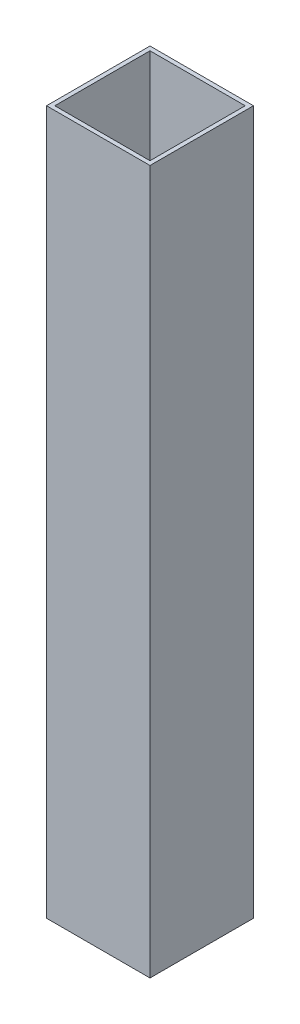
ISO-10303-21;
HEADER;
FILE_DESCRIPTION(('STEP AP214'),'2;1');
FILE_NAME('part.step','',(''),(''),'','','');
FILE_SCHEMA(('AUTOMOTIVE_DESIGN { 1 0 10303 214 1 1 1 1 }'));
ENDSEC;
DATA;
#1=APPLICATION_CONTEXT('core data for automotive mechanical design processes');
#2=APPLICATION_PROTOCOL_DEFINITION('international standard','automotive_design',2000,#1);
#3=PRODUCT_CONTEXT('',#1,'mechanical');
#4=PRODUCT('Part','Part','',(#3));
#5=PRODUCT_RELATED_PRODUCT_CATEGORY('part','',(#4));
#6=PRODUCT_DEFINITION_FORMATION('','',#4);
#7=PRODUCT_DEFINITION_CONTEXT('part definition',#1,'design');
#8=PRODUCT_DEFINITION('design','',#6,#7);
#9=PRODUCT_DEFINITION_SHAPE('','',#8);
#10=(LENGTH_UNIT() NAMED_UNIT(*) SI_UNIT(.MILLI.,.METRE.));
#11=(NAMED_UNIT(*) PLANE_ANGLE_UNIT() SI_UNIT($,.RADIAN.));
#12=(NAMED_UNIT(*) SI_UNIT($,.STERADIAN.) SOLID_ANGLE_UNIT());
#13=UNCERTAINTY_MEASURE_WITH_UNIT(LENGTH_MEASURE(1.E-05),#10,'distance_accuracy_value','');
#14=(GEOMETRIC_REPRESENTATION_CONTEXT(3) GLOBAL_UNCERTAINTY_ASSIGNED_CONTEXT((#13)) GLOBAL_UNIT_ASSIGNED_CONTEXT((#10,
#11,#12)) REPRESENTATION_CONTEXT('',''));
#15=CARTESIAN_POINT('',(0.,0.,0.));
#16=DIRECTION('',(0.,0.,1.));
#17=DIRECTION('',(1.,0.,0.));
#18=AXIS2_PLACEMENT_3D('',#15,#16,#17);
#19=CARTESIAN_POINT('',(0.,340.,0.));
#20=DIRECTION('',(0.,-1.,0.));
#21=DIRECTION('',(0.,0.,-1.));
#22=AXIS2_PLACEMENT_3D('',#19,#20,#21);
#23=PLANE('',#22);
#24=DIRECTION('',(0.,0.,-1.));
#25=VECTOR('',#24,1.);
#26=CARTESIAN_POINT('',(25.,340.,25.));
#27=LINE('',#26,#25);
#28=CARTESIAN_POINT('',(25.,340.,25.));
#29=VERTEX_POINT('',#28);
#30=CARTESIAN_POINT('',(25.,340.,-25.));
#31=VERTEX_POINT('',#30);
#32=EDGE_CURVE('E153',#29,#31,#27,.T.);
#33=ORIENTED_EDGE('',*,*,#32,.T.);
#34=DIRECTION('',(-1.,0.,0.));
#35=VECTOR('',#34,1.);
#36=CARTESIAN_POINT('',(-25.,340.,-25.));
#37=LINE('',#36,#35);
#38=CARTESIAN_POINT('',(-25.,340.,-25.));
#39=VERTEX_POINT('',#38);
#40=EDGE_CURVE('E157',#31,#39,#37,.T.);
#41=ORIENTED_EDGE('',*,*,#40,.T.);
#42=DIRECTION('',(0.,0.,1.));
#43=VECTOR('',#42,1.);
#44=CARTESIAN_POINT('',(-25.,340.,25.));
#45=LINE('',#44,#43);
#46=CARTESIAN_POINT('',(-25.,340.,25.));
#47=VERTEX_POINT('',#46);
#48=EDGE_CURVE('E161',#39,#47,#45,.T.);
#49=ORIENTED_EDGE('',*,*,#48,.T.);
#50=DIRECTION('',(1.,0.,0.));
#51=VECTOR('',#50,1.);
#52=CARTESIAN_POINT('',(-25.,340.,25.));
#53=LINE('',#52,#51);
#54=EDGE_CURVE('E164',#47,#29,#53,.T.);
#55=ORIENTED_EDGE('',*,*,#54,.T.);
#56=EDGE_LOOP('',(#33,#41,#49,#55));
#57=FACE_BOUND('',#56,.T.);
#58=DIRECTION('',(0.,0.,1.));
#59=VECTOR('',#58,1.);
#60=CARTESIAN_POINT('',(-23.,340.,23.));
#61=LINE('',#60,#59);
#62=CARTESIAN_POINT('',(-23.,340.,-23.));
#63=VERTEX_POINT('',#62);
#64=CARTESIAN_POINT('',(-23.,340.,23.));
#65=VERTEX_POINT('',#64);
#66=EDGE_CURVE('E105',#63,#65,#61,.T.);
#67=ORIENTED_EDGE('',*,*,#66,.F.);
#68=DIRECTION('',(-1.,0.,0.));
#69=VECTOR('',#68,1.);
#70=CARTESIAN_POINT('',(-23.,340.,-23.));
#71=LINE('',#70,#69);
#72=CARTESIAN_POINT('',(23.,340.,-23.));
#73=VERTEX_POINT('',#72);
#74=EDGE_CURVE('E131',#73,#63,#71,.T.);
#75=ORIENTED_EDGE('',*,*,#74,.F.);
#76=DIRECTION('',(0.,0.,-1.));
#77=VECTOR('',#76,1.);
#78=CARTESIAN_POINT('',(23.,340.,23.));
#79=LINE('',#78,#77);
#80=CARTESIAN_POINT('',(23.,340.,23.));
#81=VERTEX_POINT('',#80);
#82=EDGE_CURVE('E127',#81,#73,#79,.T.);
#83=ORIENTED_EDGE('',*,*,#82,.F.);
#84=DIRECTION('',(1.,0.,0.));
#85=VECTOR('',#84,1.);
#86=CARTESIAN_POINT('',(-23.,340.,23.));
#87=LINE('',#86,#85);
#88=EDGE_CURVE('E114',#65,#81,#87,.T.);
#89=ORIENTED_EDGE('',*,*,#88,.F.);
#90=EDGE_LOOP('',(#67,#75,#83,#89));
#91=FACE_BOUND('',#90,.T.);
#92=ADVANCED_FACE('F39',(#57,#91),#23,.F.);
#93=CARTESIAN_POINT('',(0.,0.,0.));
#94=DIRECTION('',(0.,-1.,0.));
#95=DIRECTION('',(0.,0.,-1.));
#96=AXIS2_PLACEMENT_3D('',#93,#94,#95);
#97=PLANE('',#96);
#98=DIRECTION('',(0.,0.,-1.));
#99=VECTOR('',#98,1.);
#100=CARTESIAN_POINT('',(25.,0.,25.));
#101=LINE('',#100,#99);
#102=CARTESIAN_POINT('',(25.,0.,25.));
#103=VERTEX_POINT('',#102);
#104=CARTESIAN_POINT('',(25.,0.,-25.));
#105=VERTEX_POINT('',#104);
#106=EDGE_CURVE('E123',#103,#105,#101,.T.);
#107=ORIENTED_EDGE('',*,*,#106,.F.);
#108=DIRECTION('',(1.,0.,0.));
#109=VECTOR('',#108,1.);
#110=CARTESIAN_POINT('',(-25.,0.,25.));
#111=LINE('',#110,#109);
#112=CARTESIAN_POINT('',(-25.,0.,25.));
#113=VERTEX_POINT('',#112);
#114=EDGE_CURVE('E158',#113,#103,#111,.T.);
#115=ORIENTED_EDGE('',*,*,#114,.F.);
#116=DIRECTION('',(0.,0.,1.));
#117=VECTOR('',#116,1.);
#118=CARTESIAN_POINT('',(-25.,0.,25.));
#119=LINE('',#118,#117);
#120=CARTESIAN_POINT('',(-25.,0.,-25.));
#121=VERTEX_POINT('',#120);
#122=EDGE_CURVE('E174',#121,#113,#119,.T.);
#123=ORIENTED_EDGE('',*,*,#122,.F.);
#124=DIRECTION('',(-1.,0.,0.));
#125=VECTOR('',#124,1.);
#126=CARTESIAN_POINT('',(-25.,0.,-25.));
#127=LINE('',#126,#125);
#128=EDGE_CURVE('E171',#105,#121,#127,.T.);
#129=ORIENTED_EDGE('',*,*,#128,.F.);
#130=EDGE_LOOP('',(#107,#115,#123,#129));
#131=FACE_BOUND('',#130,.T.);
#132=DIRECTION('',(-1.,0.,0.));
#133=VECTOR('',#132,1.);
#134=CARTESIAN_POINT('',(-23.,0.,-23.));
#135=LINE('',#134,#133);
#136=CARTESIAN_POINT('',(23.,0.,-23.));
#137=VERTEX_POINT('',#136);
#138=CARTESIAN_POINT('',(-23.,0.,-23.));
#139=VERTEX_POINT('',#138);
#140=EDGE_CURVE('E115',#137,#139,#135,.T.);
#141=ORIENTED_EDGE('',*,*,#140,.T.);
#142=DIRECTION('',(0.,0.,1.));
#143=VECTOR('',#142,1.);
#144=CARTESIAN_POINT('',(-23.,0.,23.));
#145=LINE('',#144,#143);
#146=CARTESIAN_POINT('',(-23.,0.,23.));
#147=VERTEX_POINT('',#146);
#148=EDGE_CURVE('E63',#139,#147,#145,.T.);
#149=ORIENTED_EDGE('',*,*,#148,.T.);
#150=DIRECTION('',(1.,0.,0.));
#151=VECTOR('',#150,1.);
#152=CARTESIAN_POINT('',(-23.,0.,23.));
#153=LINE('',#152,#151);
#154=CARTESIAN_POINT('',(23.,0.,23.));
#155=VERTEX_POINT('',#154);
#156=EDGE_CURVE('E121',#147,#155,#153,.T.);
#157=ORIENTED_EDGE('',*,*,#156,.T.);
#158=DIRECTION('',(0.,0.,-1.));
#159=VECTOR('',#158,1.);
#160=CARTESIAN_POINT('',(23.,0.,23.));
#161=LINE('',#160,#159);
#162=EDGE_CURVE('E140',#155,#137,#161,.T.);
#163=ORIENTED_EDGE('',*,*,#162,.T.);
#164=EDGE_LOOP('',(#141,#149,#157,#163));
#165=FACE_BOUND('',#164,.T.);
#166=ADVANCED_FACE('F197',(#131,#165),#97,.T.);
#167=CARTESIAN_POINT('',(25.,340.,25.));
#168=DIRECTION('',(-1.,0.,0.));
#169=DIRECTION('',(0.,0.,1.));
#170=AXIS2_PLACEMENT_3D('',#167,#168,#169);
#171=PLANE('',#170);
#172=ORIENTED_EDGE('',*,*,#106,.T.);
#173=DIRECTION('',(0.,-1.,0.));
#174=VECTOR('',#173,1.);
#175=CARTESIAN_POINT('',(25.,340.,-25.));
#176=LINE('',#175,#174);
#177=EDGE_CURVE('E11',#31,#105,#176,.T.);
#178=ORIENTED_EDGE('',*,*,#177,.F.);
#179=ORIENTED_EDGE('',*,*,#32,.F.);
#180=DIRECTION('',(0.,-1.,0.));
#181=VECTOR('',#180,1.);
#182=CARTESIAN_POINT('',(25.,340.,25.));
#183=LINE('',#182,#181);
#184=EDGE_CURVE('E167',#29,#103,#183,.T.);
#185=ORIENTED_EDGE('',*,*,#184,.T.);
#186=EDGE_LOOP('',(#172,#178,#179,#185));
#187=FACE_BOUND('',#186,.T.);
#188=ADVANCED_FACE('F41',(#187),#171,.F.);
#189=CARTESIAN_POINT('',(-25.,340.,-25.));
#190=DIRECTION('',(0.,0.,1.));
#191=DIRECTION('',(1.,0.,0.));
#192=AXIS2_PLACEMENT_3D('',#189,#190,#191);
#193=PLANE('',#192);
#194=ORIENTED_EDGE('',*,*,#128,.T.);
#195=DIRECTION('',(0.,-1.,0.));
#196=VECTOR('',#195,1.);
#197=CARTESIAN_POINT('',(-25.,340.,-25.));
#198=LINE('',#197,#196);
#199=EDGE_CURVE('E48',#39,#121,#198,.T.);
#200=ORIENTED_EDGE('',*,*,#199,.F.);
#201=ORIENTED_EDGE('',*,*,#40,.F.);
#202=ORIENTED_EDGE('',*,*,#177,.T.);
#203=EDGE_LOOP('',(#194,#200,#201,#202));
#204=FACE_BOUND('',#203,.T.);
#205=ADVANCED_FACE('F207',(#204),#193,.F.);
#206=CARTESIAN_POINT('',(-25.,340.,25.));
#207=DIRECTION('',(1.,0.,0.));
#208=DIRECTION('',(0.,0.,-1.));
#209=AXIS2_PLACEMENT_3D('',#206,#207,#208);
#210=PLANE('',#209);
#211=ORIENTED_EDGE('',*,*,#122,.T.);
#212=DIRECTION('',(0.,-1.,0.));
#213=VECTOR('',#212,1.);
#214=CARTESIAN_POINT('',(-25.,340.,25.));
#215=LINE('',#214,#213);
#216=EDGE_CURVE('E182',#47,#113,#215,.T.);
#217=ORIENTED_EDGE('',*,*,#216,.F.);
#218=ORIENTED_EDGE('',*,*,#48,.F.);
#219=ORIENTED_EDGE('',*,*,#199,.T.);
#220=EDGE_LOOP('',(#211,#217,#218,#219));
#221=FACE_BOUND('',#220,.T.);
#222=ADVANCED_FACE('F191',(#221),#210,.F.);
#223=CARTESIAN_POINT('',(-25.,340.,25.));
#224=DIRECTION('',(0.,0.,-1.));
#225=DIRECTION('',(-1.,0.,0.));
#226=AXIS2_PLACEMENT_3D('',#223,#224,#225);
#227=PLANE('',#226);
#228=ORIENTED_EDGE('',*,*,#114,.T.);
#229=ORIENTED_EDGE('',*,*,#184,.F.);
#230=ORIENTED_EDGE('',*,*,#54,.F.);
#231=ORIENTED_EDGE('',*,*,#216,.T.);
#232=EDGE_LOOP('',(#228,#229,#230,#231));
#233=FACE_BOUND('',#232,.T.);
#234=ADVANCED_FACE('F201',(#233),#227,.F.);
#235=CARTESIAN_POINT('',(-23.,340.,23.));
#236=DIRECTION('',(1.,0.,0.));
#237=DIRECTION('',(0.,0.,-1.));
#238=AXIS2_PLACEMENT_3D('',#235,#236,#237);
#239=PLANE('',#238);
#240=ORIENTED_EDGE('',*,*,#148,.F.);
#241=DIRECTION('',(0.,-1.,0.));
#242=VECTOR('',#241,1.);
#243=CARTESIAN_POINT('',(-23.,340.,-23.));
#244=LINE('',#243,#242);
#245=EDGE_CURVE('E109',#63,#139,#244,.T.);
#246=ORIENTED_EDGE('',*,*,#245,.F.);
#247=ORIENTED_EDGE('',*,*,#66,.T.);
#248=DIRECTION('',(0.,-1.,0.));
#249=VECTOR('',#248,1.);
#250=CARTESIAN_POINT('',(-23.,340.,23.));
#251=LINE('',#250,#249);
#252=EDGE_CURVE('E108',#65,#147,#251,.T.);
#253=ORIENTED_EDGE('',*,*,#252,.T.);
#254=EDGE_LOOP('',(#240,#246,#247,#253));
#255=FACE_BOUND('',#254,.T.);
#256=ADVANCED_FACE('F107',(#255),#239,.T.);
#257=CARTESIAN_POINT('',(-23.,340.,23.));
#258=DIRECTION('',(0.,0.,-1.));
#259=DIRECTION('',(-1.,0.,0.));
#260=AXIS2_PLACEMENT_3D('',#257,#258,#259);
#261=PLANE('',#260);
#262=ORIENTED_EDGE('',*,*,#156,.F.);
#263=ORIENTED_EDGE('',*,*,#252,.F.);
#264=ORIENTED_EDGE('',*,*,#88,.T.);
#265=DIRECTION('',(0.,-1.,0.));
#266=VECTOR('',#265,1.);
#267=CARTESIAN_POINT('',(23.,340.,23.));
#268=LINE('',#267,#266);
#269=EDGE_CURVE('E124',#81,#155,#268,.T.);
#270=ORIENTED_EDGE('',*,*,#269,.T.);
#271=EDGE_LOOP('',(#262,#263,#264,#270));
#272=FACE_BOUND('',#271,.T.);
#273=ADVANCED_FACE('F118',(#272),#261,.T.);
#274=CARTESIAN_POINT('',(23.,340.,23.));
#275=DIRECTION('',(-1.,0.,0.));
#276=DIRECTION('',(0.,0.,1.));
#277=AXIS2_PLACEMENT_3D('',#274,#275,#276);
#278=PLANE('',#277);
#279=ORIENTED_EDGE('',*,*,#162,.F.);
#280=ORIENTED_EDGE('',*,*,#269,.F.);
#281=ORIENTED_EDGE('',*,*,#82,.T.);
#282=DIRECTION('',(0.,-1.,0.));
#283=VECTOR('',#282,1.);
#284=CARTESIAN_POINT('',(23.,340.,-23.));
#285=LINE('',#284,#283);
#286=EDGE_CURVE('E55',#73,#137,#285,.T.);
#287=ORIENTED_EDGE('',*,*,#286,.T.);
#288=EDGE_LOOP('',(#279,#280,#281,#287));
#289=FACE_BOUND('',#288,.T.);
#290=ADVANCED_FACE('F230',(#289),#278,.T.);
#291=CARTESIAN_POINT('',(-23.,340.,-23.));
#292=DIRECTION('',(0.,0.,1.));
#293=DIRECTION('',(1.,0.,0.));
#294=AXIS2_PLACEMENT_3D('',#291,#292,#293);
#295=PLANE('',#294);
#296=ORIENTED_EDGE('',*,*,#140,.F.);
#297=ORIENTED_EDGE('',*,*,#286,.F.);
#298=ORIENTED_EDGE('',*,*,#74,.T.);
#299=ORIENTED_EDGE('',*,*,#245,.T.);
#300=EDGE_LOOP('',(#296,#297,#298,#299));
#301=FACE_BOUND('',#300,.T.);
#302=ADVANCED_FACE('F234',(#301),#295,.T.);
#303=CLOSED_SHELL('',(#92,#166,#188,#205,#222,#234,#256,#273,#290,#302));
#304=MANIFOLD_SOLID_BREP('B2',#303);
#305=ADVANCED_BREP_SHAPE_REPRESENTATION('',(#18,#304),#14);
#306=SHAPE_DEFINITION_REPRESENTATION(#9,#305);
ENDSEC;
END-ISO-10303-21;
